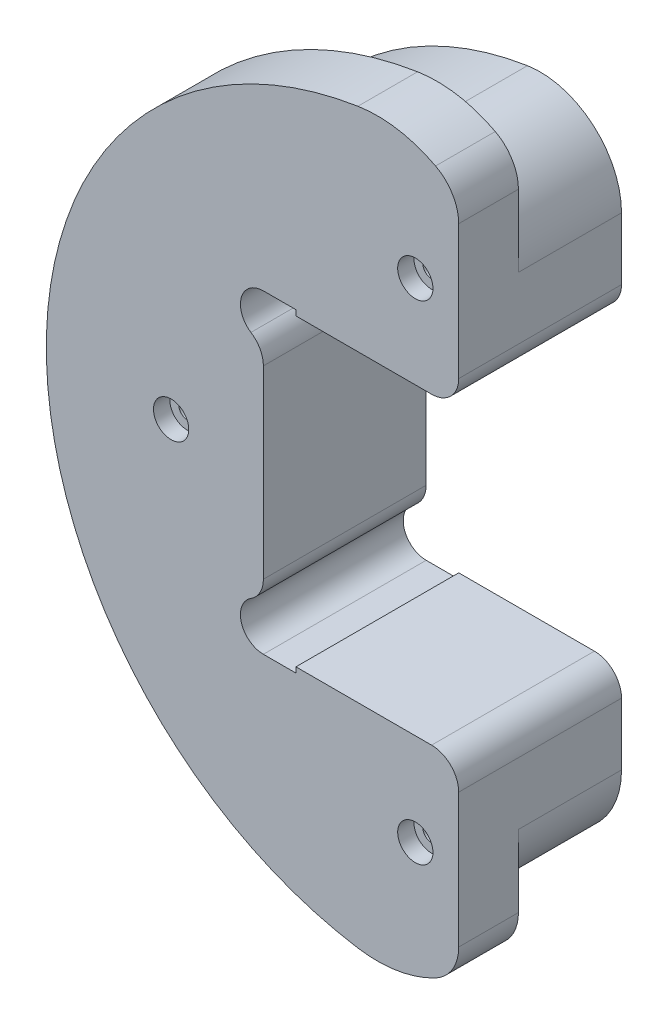
ISO-10303-21;
HEADER;
FILE_DESCRIPTION(('STEP AP214'),'2;1');
FILE_NAME('part.step','',(''),(''),'','','');
FILE_SCHEMA(('AUTOMOTIVE_DESIGN { 1 0 10303 214 1 1 1 1 }'));
ENDSEC;
DATA;
#1=APPLICATION_CONTEXT('core data for automotive mechanical design processes');
#2=APPLICATION_PROTOCOL_DEFINITION('international standard','automotive_design',2000,#1);
#3=PRODUCT_CONTEXT('',#1,'mechanical');
#4=PRODUCT('Part','Part','',(#3));
#5=PRODUCT_RELATED_PRODUCT_CATEGORY('part','',(#4));
#6=PRODUCT_DEFINITION_FORMATION('','',#4);
#7=PRODUCT_DEFINITION_CONTEXT('part definition',#1,'design');
#8=PRODUCT_DEFINITION('design','',#6,#7);
#9=PRODUCT_DEFINITION_SHAPE('','',#8);
#10=(LENGTH_UNIT() NAMED_UNIT(*) SI_UNIT(.MILLI.,.METRE.));
#11=(NAMED_UNIT(*) PLANE_ANGLE_UNIT() SI_UNIT($,.RADIAN.));
#12=(NAMED_UNIT(*) SI_UNIT($,.STERADIAN.) SOLID_ANGLE_UNIT());
#13=UNCERTAINTY_MEASURE_WITH_UNIT(LENGTH_MEASURE(1.E-05),#10,'distance_accuracy_value','');
#14=(GEOMETRIC_REPRESENTATION_CONTEXT(3) GLOBAL_UNCERTAINTY_ASSIGNED_CONTEXT((#13)) GLOBAL_UNIT_ASSIGNED_CONTEXT((#10,
#11,#12)) REPRESENTATION_CONTEXT('',''));
#15=CARTESIAN_POINT('',(0.,0.,0.));
#16=DIRECTION('',(0.,0.,1.));
#17=DIRECTION('',(1.,0.,0.));
#18=AXIS2_PLACEMENT_3D('',#15,#16,#17);
#19=CARTESIAN_POINT('',(0.,0.,30.));
#20=DIRECTION('',(0.,0.,-1.));
#21=DIRECTION('',(-1.,0.,0.));
#22=AXIS2_PLACEMENT_3D('',#19,#20,#21);
#23=CYLINDRICAL_SURFACE('',#22,60.);
#24=CARTESIAN_POINT('',(0.,0.,19.));
#25=DIRECTION('',(0.,0.,-1.));
#26=DIRECTION('',(1.,0.,0.));
#27=AXIS2_PLACEMENT_3D('',#24,#25,#26);
#28=CIRCLE('',#27,60.);
#29=CARTESIAN_POINT('',(-9.33333333333332,-59.269628722381,19.));
#30=VERTEX_POINT('',#29);
#31=CARTESIAN_POINT('',(-9.33333333333333,59.269628722381,19.));
#32=VERTEX_POINT('',#31);
#33=EDGE_CURVE('E212',#30,#32,#28,.T.);
#34=ORIENTED_EDGE('',*,*,#33,.T.);
#35=DIRECTION('',(0.,0.,-1.));
#36=VECTOR('',#35,1.);
#37=CARTESIAN_POINT('',(-9.33333333333333,59.269628722381,30.));
#38=LINE('',#37,#36);
#39=CARTESIAN_POINT('',(-9.33333333333333,59.269628722381,0.));
#40=VERTEX_POINT('',#39);
#41=EDGE_CURVE('E231',#32,#40,#38,.T.);
#42=ORIENTED_EDGE('',*,*,#41,.T.);
#43=CARTESIAN_POINT('',(0.,0.,0.));
#44=DIRECTION('',(0.,0.,1.));
#45=DIRECTION('',(1.,0.,0.));
#46=AXIS2_PLACEMENT_3D('',#43,#44,#45);
#47=CIRCLE('',#46,60.);
#48=CARTESIAN_POINT('',(-9.33333333333332,-59.269628722381,0.));
#49=VERTEX_POINT('',#48);
#50=EDGE_CURVE('E360',#40,#49,#47,.T.);
#51=ORIENTED_EDGE('',*,*,#50,.T.);
#52=DIRECTION('',(0.,0.,-1.));
#53=VECTOR('',#52,1.);
#54=CARTESIAN_POINT('',(-9.33333333333332,-59.269628722381,30.));
#55=LINE('',#54,#53);
#56=EDGE_CURVE('E233',#49,#30,#55,.F.);
#57=ORIENTED_EDGE('',*,*,#56,.T.);
#58=EDGE_LOOP('',(#34,#42,#51,#57));
#59=FACE_BOUND('',#58,.T.);
#60=ADVANCED_FACE('F40',(#59),#23,.T.);
#61=CARTESIAN_POINT('',(-6.99999999999999,-44.4522215417857,30.));
#62=DIRECTION('',(0.,0.,-1.));
#63=DIRECTION('',(-1.,0.,0.));
#64=AXIS2_PLACEMENT_3D('',#61,#62,#63);
#65=CYLINDRICAL_SURFACE('',#64,15.);
#66=DIRECTION('',(0.,0.,-1.));
#67=VECTOR('',#66,1.);
#68=CARTESIAN_POINT('',(8.00000000000001,-44.4522215417857,30.));
#69=LINE('',#68,#67);
#70=CARTESIAN_POINT('',(8.00000000000001,-44.4522215417857,19.));
#71=VERTEX_POINT('',#70);
#72=CARTESIAN_POINT('',(8.00000000000001,-44.4522215417857,0.));
#73=VERTEX_POINT('',#72);
#74=EDGE_CURVE('E203',#71,#73,#69,.T.);
#75=ORIENTED_EDGE('',*,*,#74,.F.);
#76=CARTESIAN_POINT('',(-6.99999999999999,-44.4522215417857,19.));
#77=DIRECTION('',(0.,0.,-1.));
#78=DIRECTION('',(1.,0.,0.));
#79=AXIS2_PLACEMENT_3D('',#76,#77,#78);
#80=CIRCLE('',#79,15.);
#81=EDGE_CURVE('E205',#71,#30,#80,.T.);
#82=ORIENTED_EDGE('',*,*,#81,.T.);
#83=ORIENTED_EDGE('',*,*,#56,.F.);
#84=CARTESIAN_POINT('',(-6.99999999999999,-44.4522215417857,0.));
#85=DIRECTION('',(0.,0.,1.));
#86=DIRECTION('',(1.,0.,0.));
#87=AXIS2_PLACEMENT_3D('',#84,#85,#86);
#88=CIRCLE('',#87,15.);
#89=EDGE_CURVE('E218',#73,#49,#88,.F.);
#90=ORIENTED_EDGE('',*,*,#89,.F.);
#91=EDGE_LOOP('',(#75,#82,#83,#90));
#92=FACE_BOUND('',#91,.T.);
#93=ADVANCED_FACE('F217',(#92),#65,.T.);
#94=CARTESIAN_POINT('',(-7.,44.4522215417857,30.));
#95=DIRECTION('',(0.,0.,-1.));
#96=DIRECTION('',(-1.,0.,0.));
#97=AXIS2_PLACEMENT_3D('',#94,#95,#96);
#98=CYLINDRICAL_SURFACE('',#97,15.);
#99=ORIENTED_EDGE('',*,*,#41,.F.);
#100=CARTESIAN_POINT('',(-7.,44.4522215417857,19.));
#101=DIRECTION('',(0.,0.,-1.));
#102=DIRECTION('',(1.,0.,0.));
#103=AXIS2_PLACEMENT_3D('',#100,#101,#102);
#104=CIRCLE('',#103,15.);
#105=CARTESIAN_POINT('',(8.,44.4522215417857,19.));
#106=VERTEX_POINT('',#105);
#107=EDGE_CURVE('E519',#32,#106,#104,.T.);
#108=ORIENTED_EDGE('',*,*,#107,.T.);
#109=DIRECTION('',(0.,0.,-1.));
#110=VECTOR('',#109,1.);
#111=CARTESIAN_POINT('',(8.,44.4522215417857,30.));
#112=LINE('',#111,#110);
#113=CARTESIAN_POINT('',(8.,44.4522215417857,0.));
#114=VERTEX_POINT('',#113);
#115=EDGE_CURVE('E235',#114,#106,#112,.F.);
#116=ORIENTED_EDGE('',*,*,#115,.F.);
#117=CARTESIAN_POINT('',(-7.,44.4522215417857,0.));
#118=DIRECTION('',(0.,0.,1.));
#119=DIRECTION('',(1.,0.,0.));
#120=AXIS2_PLACEMENT_3D('',#117,#118,#119);
#121=CIRCLE('',#120,15.);
#122=EDGE_CURVE('E220',#40,#114,#121,.F.);
#123=ORIENTED_EDGE('',*,*,#122,.F.);
#124=EDGE_LOOP('',(#99,#108,#116,#123));
#125=FACE_BOUND('',#124,.T.);
#126=ADVANCED_FACE('F459',(#125),#98,.T.);
#127=CARTESIAN_POINT('',(-28.,29.,30.));
#128=DIRECTION('',(-1.,0.,0.));
#129=DIRECTION('',(0.,0.,1.));
#130=AXIS2_PLACEMENT_3D('',#127,#128,#129);
#131=PLANE('',#130);
#132=DIRECTION('',(0.,1.,0.));
#133=VECTOR('',#132,1.);
#134=CARTESIAN_POINT('',(-28.,29.,30.));
#135=LINE('',#134,#133);
#136=CARTESIAN_POINT('',(-28.,-17.0225407127802,30.));
#137=VERTEX_POINT('',#136);
#138=CARTESIAN_POINT('',(-28.,17.0225407127803,30.));
#139=VERTEX_POINT('',#138);
#140=EDGE_CURVE('E371',#137,#139,#135,.T.);
#141=ORIENTED_EDGE('',*,*,#140,.F.);
#142=DIRECTION('',(0.,0.,1.));
#143=VECTOR('',#142,1.);
#144=CARTESIAN_POINT('',(-28.,-17.0225407127802,0.));
#145=LINE('',#144,#143);
#146=CARTESIAN_POINT('',(-28.,-17.0225407127802,0.));
#147=VERTEX_POINT('',#146);
#148=EDGE_CURVE('E267',#137,#147,#145,.F.);
#149=ORIENTED_EDGE('',*,*,#148,.T.);
#150=DIRECTION('',(0.,1.,0.));
#151=VECTOR('',#150,1.);
#152=CARTESIAN_POINT('',(-28.,29.,0.));
#153=LINE('',#152,#151);
#154=CARTESIAN_POINT('',(-28.,17.0225407127803,0.));
#155=VERTEX_POINT('',#154);
#156=EDGE_CURVE('E395',#147,#155,#153,.T.);
#157=ORIENTED_EDGE('',*,*,#156,.T.);
#158=DIRECTION('',(0.,0.,1.));
#159=VECTOR('',#158,1.);
#160=CARTESIAN_POINT('',(-28.,17.0225407127802,30.));
#161=LINE('',#160,#159);
#162=EDGE_CURVE('E265',#155,#139,#161,.T.);
#163=ORIENTED_EDGE('',*,*,#162,.T.);
#164=EDGE_LOOP('',(#141,#149,#157,#163));
#165=FACE_BOUND('',#164,.T.);
#166=ADVANCED_FACE('F466',(#165),#131,.F.);
#167=CARTESIAN_POINT('',(0.,0.,30.));
#168=DIRECTION('',(0.,0.,1.));
#169=DIRECTION('',(1.,0.,0.));
#170=AXIS2_PLACEMENT_3D('',#167,#168,#169);
#171=PLANE('',#170);
#172=DIRECTION('',(0.,1.,0.));
#173=VECTOR('',#172,1.);
#174=CARTESIAN_POINT('',(8.,59.464274989274,30.));
#175=LINE('',#174,#173);
#176=CARTESIAN_POINT('',(8.,33.,30.));
#177=VERTEX_POINT('',#176);
#178=CARTESIAN_POINT('',(8.,57.7187207032073,30.));
#179=VERTEX_POINT('',#178);
#180=EDGE_CURVE('E381',#177,#179,#175,.T.);
#181=ORIENTED_EDGE('',*,*,#180,.T.);
#182=CARTESIAN_POINT('',(0.,57.7187207032073,30.));
#183=DIRECTION('',(0.,0.,1.));
#184=DIRECTION('',(1.,0.,0.));
#185=AXIS2_PLACEMENT_3D('',#182,#183,#184);
#186=CIRCLE('',#185,8.);
#187=CARTESIAN_POINT('',(3.73333333333334,64.7941869226322,30.));
#188=VERTEX_POINT('',#187);
#189=EDGE_CURVE('E280',#179,#188,#186,.T.);
#190=ORIENTED_EDGE('',*,*,#189,.T.);
#191=CARTESIAN_POINT('',(-7.,44.4522215417857,30.));
#192=DIRECTION('',(0.,0.,1.));
#193=DIRECTION('',(1.,0.,0.));
#194=AXIS2_PLACEMENT_3D('',#191,#192,#193);
#195=CIRCLE('',#194,23.);
#196=CARTESIAN_POINT('',(-10.5777777777778,67.1722458853651,30.));
#197=VERTEX_POINT('',#196);
#198=EDGE_CURVE('E301',#188,#197,#195,.T.);
#199=ORIENTED_EDGE('',*,*,#198,.T.);
#200=CARTESIAN_POINT('',(0.,0.,30.));
#201=DIRECTION('',(0.,0.,1.));
#202=DIRECTION('',(1.,0.,0.));
#203=AXIS2_PLACEMENT_3D('',#200,#201,#202);
#204=CIRCLE('',#203,68.);
#205=CARTESIAN_POINT('',(-10.5777777777778,-67.1722458853651,30.));
#206=VERTEX_POINT('',#205);
#207=EDGE_CURVE('E300',#197,#206,#204,.T.);
#208=ORIENTED_EDGE('',*,*,#207,.T.);
#209=CARTESIAN_POINT('',(-6.99999999999999,-44.4522215417857,30.));
#210=DIRECTION('',(0.,0.,1.));
#211=DIRECTION('',(1.,0.,0.));
#212=AXIS2_PLACEMENT_3D('',#209,#210,#211);
#213=CIRCLE('',#212,23.);
#214=CARTESIAN_POINT('',(3.73333333333335,-64.7941869226322,30.));
#215=VERTEX_POINT('',#214);
#216=EDGE_CURVE('E292',#206,#215,#213,.T.);
#217=ORIENTED_EDGE('',*,*,#216,.T.);
#218=CARTESIAN_POINT('',(0.,-57.7187207032073,30.));
#219=DIRECTION('',(0.,0.,1.));
#220=DIRECTION('',(1.,0.,0.));
#221=AXIS2_PLACEMENT_3D('',#218,#219,#220);
#222=CIRCLE('',#221,8.);
#223=CARTESIAN_POINT('',(8.00000000000002,-57.7187207032073,30.));
#224=VERTEX_POINT('',#223);
#225=EDGE_CURVE('E278',#215,#224,#222,.T.);
#226=ORIENTED_EDGE('',*,*,#225,.T.);
#227=DIRECTION('',(0.,1.,0.));
#228=VECTOR('',#227,1.);
#229=CARTESIAN_POINT('',(8.00000000000001,-28.,30.));
#230=LINE('',#229,#228);
#231=CARTESIAN_POINT('',(8.00000000000001,-33.,30.));
#232=VERTEX_POINT('',#231);
#233=EDGE_CURVE('E361',#224,#232,#230,.T.);
#234=ORIENTED_EDGE('',*,*,#233,.T.);
#235=CARTESIAN_POINT('',(3.00000000000001,-33.,30.));
#236=DIRECTION('',(0.,0.,1.));
#237=DIRECTION('',(1.,0.,0.));
#238=AXIS2_PLACEMENT_3D('',#235,#236,#237);
#239=CIRCLE('',#238,5.);
#240=CARTESIAN_POINT('',(3.00000000000001,-28.,30.));
#241=VERTEX_POINT('',#240);
#242=EDGE_CURVE('E255',#232,#241,#239,.T.);
#243=ORIENTED_EDGE('',*,*,#242,.T.);
#244=DIRECTION('',(-1.,0.,0.));
#245=VECTOR('',#244,1.);
#246=CARTESIAN_POINT('',(-22.,-28.,30.));
#247=LINE('',#246,#245);
#248=CARTESIAN_POINT('',(-22.,-28.,30.));
#249=VERTEX_POINT('',#248);
#250=EDGE_CURVE('E363',#241,#249,#247,.T.);
#251=ORIENTED_EDGE('',*,*,#250,.T.);
#252=DIRECTION('',(0.,-1.,0.));
#253=VECTOR('',#252,1.);
#254=CARTESIAN_POINT('',(-22.,-29.,30.));
#255=LINE('',#254,#253);
#256=CARTESIAN_POINT('',(-22.,-29.,30.));
#257=VERTEX_POINT('',#256);
#258=EDGE_CURVE('E366',#249,#257,#255,.T.);
#259=ORIENTED_EDGE('',*,*,#258,.T.);
#260=DIRECTION('',(-1.,0.,0.));
#261=VECTOR('',#260,1.);
#262=CARTESIAN_POINT('',(-28.,-29.,30.));
#263=LINE('',#262,#261);
#264=CARTESIAN_POINT('',(-28.,-29.,30.));
#265=VERTEX_POINT('',#264);
#266=EDGE_CURVE('E368',#257,#265,#263,.T.);
#267=ORIENTED_EDGE('',*,*,#266,.T.);
#268=CARTESIAN_POINT('',(-28.,-24.775,30.));
#269=DIRECTION('',(0.,0.,1.));
#270=DIRECTION('',(-1.,0.,0.));
#271=AXIS2_PLACEMENT_3D('',#268,#269,#270);
#272=CIRCLE('',#271,4.225);
#273=CARTESIAN_POINT('',(-30.289972899729,-21.2244156652029,30.));
#274=VERTEX_POINT('',#273);
#275=EDGE_CURVE('E315',#274,#265,#272,.T.);
#276=ORIENTED_EDGE('',*,*,#275,.F.);
#277=CARTESIAN_POINT('',(-33.,-17.0225407127802,30.));
#278=DIRECTION('',(0.,0.,1.));
#279=DIRECTION('',(1.,0.,0.));
#280=AXIS2_PLACEMENT_3D('',#277,#278,#279);
#281=CIRCLE('',#280,5.);
#282=EDGE_CURVE('E253',#274,#137,#281,.T.);
#283=ORIENTED_EDGE('',*,*,#282,.T.);
#284=ORIENTED_EDGE('',*,*,#140,.T.);
#285=CARTESIAN_POINT('',(-33.,17.0225407127802,30.));
#286=DIRECTION('',(0.,0.,1.));
#287=DIRECTION('',(1.,0.,0.));
#288=AXIS2_PLACEMENT_3D('',#285,#286,#287);
#289=CIRCLE('',#288,5.);
#290=CARTESIAN_POINT('',(-30.289972899729,21.2244156652029,30.));
#291=VERTEX_POINT('',#290);
#292=EDGE_CURVE('E251',#139,#291,#289,.T.);
#293=ORIENTED_EDGE('',*,*,#292,.T.);
#294=CARTESIAN_POINT('',(-28.,24.775,30.));
#295=DIRECTION('',(0.,0.,1.));
#296=DIRECTION('',(1.,0.,0.));
#297=AXIS2_PLACEMENT_3D('',#294,#295,#296);
#298=CIRCLE('',#297,4.225);
#299=CARTESIAN_POINT('',(-28.,29.,30.));
#300=VERTEX_POINT('',#299);
#301=EDGE_CURVE('E319',#300,#291,#298,.T.);
#302=ORIENTED_EDGE('',*,*,#301,.F.);
#303=DIRECTION('',(1.,0.,0.));
#304=VECTOR('',#303,1.);
#305=CARTESIAN_POINT('',(-22.,29.,30.));
#306=LINE('',#305,#304);
#307=CARTESIAN_POINT('',(-22.,29.,30.));
#308=VERTEX_POINT('',#307);
#309=EDGE_CURVE('E374',#300,#308,#306,.T.);
#310=ORIENTED_EDGE('',*,*,#309,.T.);
#311=DIRECTION('',(0.,-1.,0.));
#312=VECTOR('',#311,1.);
#313=CARTESIAN_POINT('',(-22.,28.,30.));
#314=LINE('',#313,#312);
#315=CARTESIAN_POINT('',(-22.,28.,30.));
#316=VERTEX_POINT('',#315);
#317=EDGE_CURVE('E376',#308,#316,#314,.T.);
#318=ORIENTED_EDGE('',*,*,#317,.T.);
#319=DIRECTION('',(1.,0.,0.));
#320=VECTOR('',#319,1.);
#321=CARTESIAN_POINT('',(8.,28.,30.));
#322=LINE('',#321,#320);
#323=CARTESIAN_POINT('',(3.,28.,30.));
#324=VERTEX_POINT('',#323);
#325=EDGE_CURVE('E378',#316,#324,#322,.T.);
#326=ORIENTED_EDGE('',*,*,#325,.T.);
#327=CARTESIAN_POINT('',(3.,33.,30.));
#328=DIRECTION('',(0.,0.,1.));
#329=DIRECTION('',(1.,0.,0.));
#330=AXIS2_PLACEMENT_3D('',#327,#328,#329);
#331=CIRCLE('',#330,5.);
#332=EDGE_CURVE('E257',#324,#177,#331,.T.);
#333=ORIENTED_EDGE('',*,*,#332,.T.);
#334=EDGE_LOOP('',(#181,#190,#199,#208,#217,#226,#234,#243,#251,#259,#267,#276,#283,#284,#293,
#302,#310,#318,#326,#333));
#335=FACE_BOUND('',#334,.T.);
#336=CARTESIAN_POINT('',(0.,45.,30.));
#337=DIRECTION('',(0.,0.,1.));
#338=DIRECTION('',(1.,0.,0.));
#339=AXIS2_PLACEMENT_3D('',#336,#337,#338);
#340=CIRCLE('',#339,3.25);
#341=CARTESIAN_POINT('',(3.25,45.,30.));
#342=VERTEX_POINT('',#341);
#343=EDGE_CURVE('E322',#342,#342,#340,.T.);
#344=ORIENTED_EDGE('',*,*,#343,.F.);
#345=EDGE_LOOP('',(#344));
#346=FACE_BOUND('',#345,.T.);
#347=CARTESIAN_POINT('',(-45.,0.,30.));
#348=DIRECTION('',(0.,0.,1.));
#349=DIRECTION('',(1.,0.,0.));
#350=AXIS2_PLACEMENT_3D('',#347,#348,#349);
#351=CIRCLE('',#350,3.25);
#352=CARTESIAN_POINT('',(-41.75,0.,30.));
#353=VERTEX_POINT('',#352);
#354=EDGE_CURVE('E336',#353,#353,#351,.T.);
#355=ORIENTED_EDGE('',*,*,#354,.F.);
#356=EDGE_LOOP('',(#355));
#357=FACE_BOUND('',#356,.T.);
#358=CARTESIAN_POINT('',(0.,-45.,30.));
#359=DIRECTION('',(0.,0.,1.));
#360=DIRECTION('',(1.,0.,0.));
#361=AXIS2_PLACEMENT_3D('',#358,#359,#360);
#362=CIRCLE('',#361,3.25);
#363=CARTESIAN_POINT('',(3.25,-45.,30.));
#364=VERTEX_POINT('',#363);
#365=EDGE_CURVE('E348',#364,#364,#362,.T.);
#366=ORIENTED_EDGE('',*,*,#365,.F.);
#367=EDGE_LOOP('',(#366));
#368=FACE_BOUND('',#367,.T.);
#369=ADVANCED_FACE('F297',(#335,#346,#357,#368),#171,.T.);
#370=CARTESIAN_POINT('',(0.,0.,0.));
#371=DIRECTION('',(0.,0.,1.));
#372=DIRECTION('',(1.,0.,0.));
#373=AXIS2_PLACEMENT_3D('',#370,#371,#372);
#374=PLANE('',#373);
#375=CARTESIAN_POINT('',(0.,45.,0.));
#376=DIRECTION('',(0.,0.,1.));
#377=DIRECTION('',(1.,0.,0.));
#378=AXIS2_PLACEMENT_3D('',#375,#376,#377);
#379=CIRCLE('',#378,1.59999999999999);
#380=CARTESIAN_POINT('',(1.59999999999999,45.,0.));
#381=VERTEX_POINT('',#380);
#382=EDGE_CURVE('E333',#381,#381,#379,.T.);
#383=ORIENTED_EDGE('',*,*,#382,.T.);
#384=EDGE_LOOP('',(#383));
#385=FACE_BOUND('',#384,.T.);
#386=CARTESIAN_POINT('',(-45.,0.,0.));
#387=DIRECTION('',(0.,0.,1.));
#388=DIRECTION('',(1.,0.,0.));
#389=AXIS2_PLACEMENT_3D('',#386,#387,#388);
#390=CIRCLE('',#389,1.59999999999999);
#391=CARTESIAN_POINT('',(-43.4,0.,0.));
#392=VERTEX_POINT('',#391);
#393=EDGE_CURVE('E345',#392,#392,#390,.T.);
#394=ORIENTED_EDGE('',*,*,#393,.T.);
#395=EDGE_LOOP('',(#394));
#396=FACE_BOUND('',#395,.T.);
#397=CARTESIAN_POINT('',(0.,-45.,0.));
#398=DIRECTION('',(0.,0.,1.));
#399=DIRECTION('',(1.,0.,0.));
#400=AXIS2_PLACEMENT_3D('',#397,#398,#399);
#401=CIRCLE('',#400,1.59999999999999);
#402=CARTESIAN_POINT('',(1.6,-45.,0.));
#403=VERTEX_POINT('',#402);
#404=EDGE_CURVE('E357',#403,#403,#401,.T.);
#405=ORIENTED_EDGE('',*,*,#404,.T.);
#406=EDGE_LOOP('',(#405));
#407=FACE_BOUND('',#406,.T.);
#408=DIRECTION('',(0.,1.,0.));
#409=VECTOR('',#408,1.);
#410=CARTESIAN_POINT('',(8.,59.464274989274,0.));
#411=LINE('',#410,#409);
#412=CARTESIAN_POINT('',(8.,33.,0.));
#413=VERTEX_POINT('',#412);
#414=EDGE_CURVE('E364',#413,#114,#411,.T.);
#415=ORIENTED_EDGE('',*,*,#414,.F.);
#416=CARTESIAN_POINT('',(3.,33.,0.));
#417=DIRECTION('',(0.,0.,1.));
#418=DIRECTION('',(1.,0.,0.));
#419=AXIS2_PLACEMENT_3D('',#416,#417,#418);
#420=CIRCLE('',#419,5.);
#421=CARTESIAN_POINT('',(3.,28.,0.));
#422=VERTEX_POINT('',#421);
#423=EDGE_CURVE('E247',#413,#422,#420,.F.);
#424=ORIENTED_EDGE('',*,*,#423,.T.);
#425=DIRECTION('',(1.,0.,0.));
#426=VECTOR('',#425,1.);
#427=CARTESIAN_POINT('',(8.,28.,0.));
#428=LINE('',#427,#426);
#429=CARTESIAN_POINT('',(-22.,28.,0.));
#430=VERTEX_POINT('',#429);
#431=EDGE_CURVE('E402',#430,#422,#428,.T.);
#432=ORIENTED_EDGE('',*,*,#431,.F.);
#433=DIRECTION('',(0.,-1.,0.));
#434=VECTOR('',#433,1.);
#435=CARTESIAN_POINT('',(-22.,28.,0.));
#436=LINE('',#435,#434);
#437=CARTESIAN_POINT('',(-22.,29.,0.));
#438=VERTEX_POINT('',#437);
#439=EDGE_CURVE('E400',#438,#430,#436,.T.);
#440=ORIENTED_EDGE('',*,*,#439,.F.);
#441=DIRECTION('',(1.,0.,0.));
#442=VECTOR('',#441,1.);
#443=CARTESIAN_POINT('',(-22.,29.,0.));
#444=LINE('',#443,#442);
#445=CARTESIAN_POINT('',(-28.,29.,0.));
#446=VERTEX_POINT('',#445);
#447=EDGE_CURVE('E398',#446,#438,#444,.T.);
#448=ORIENTED_EDGE('',*,*,#447,.F.);
#449=CARTESIAN_POINT('',(-28.,24.775,0.));
#450=DIRECTION('',(0.,0.,1.));
#451=DIRECTION('',(1.,0.,0.));
#452=AXIS2_PLACEMENT_3D('',#449,#450,#451);
#453=CIRCLE('',#452,4.225);
#454=CARTESIAN_POINT('',(-30.289972899729,21.2244156652029,0.));
#455=VERTEX_POINT('',#454);
#456=EDGE_CURVE('E317',#446,#455,#453,.T.);
#457=ORIENTED_EDGE('',*,*,#456,.T.);
#458=CARTESIAN_POINT('',(-33.,17.0225407127802,0.));
#459=DIRECTION('',(0.,0.,1.));
#460=DIRECTION('',(1.,0.,0.));
#461=AXIS2_PLACEMENT_3D('',#458,#459,#460);
#462=CIRCLE('',#461,5.);
#463=EDGE_CURVE('E241',#455,#155,#462,.F.);
#464=ORIENTED_EDGE('',*,*,#463,.T.);
#465=ORIENTED_EDGE('',*,*,#156,.F.);
#466=CARTESIAN_POINT('',(-33.,-17.0225407127802,0.));
#467=DIRECTION('',(0.,0.,1.));
#468=DIRECTION('',(1.,0.,0.));
#469=AXIS2_PLACEMENT_3D('',#466,#467,#468);
#470=CIRCLE('',#469,5.);
#471=CARTESIAN_POINT('',(-30.289972899729,-21.2244156652029,0.));
#472=VERTEX_POINT('',#471);
#473=EDGE_CURVE('E243',#147,#472,#470,.F.);
#474=ORIENTED_EDGE('',*,*,#473,.T.);
#475=CARTESIAN_POINT('',(-28.,-24.775,0.));
#476=DIRECTION('',(0.,0.,1.));
#477=DIRECTION('',(-1.,0.,0.));
#478=AXIS2_PLACEMENT_3D('',#475,#476,#477);
#479=CIRCLE('',#478,4.225);
#480=CARTESIAN_POINT('',(-28.,-29.,0.));
#481=VERTEX_POINT('',#480);
#482=EDGE_CURVE('E311',#472,#481,#479,.T.);
#483=ORIENTED_EDGE('',*,*,#482,.T.);
#484=DIRECTION('',(-1.,0.,0.));
#485=VECTOR('',#484,1.);
#486=CARTESIAN_POINT('',(-28.,-29.,0.));
#487=LINE('',#486,#485);
#488=CARTESIAN_POINT('',(-22.,-29.,0.));
#489=VERTEX_POINT('',#488);
#490=EDGE_CURVE('E392',#489,#481,#487,.T.);
#491=ORIENTED_EDGE('',*,*,#490,.F.);
#492=DIRECTION('',(0.,-1.,0.));
#493=VECTOR('',#492,1.);
#494=CARTESIAN_POINT('',(-22.,-29.,0.));
#495=LINE('',#494,#493);
#496=CARTESIAN_POINT('',(-22.,-28.,0.));
#497=VERTEX_POINT('',#496);
#498=EDGE_CURVE('E390',#497,#489,#495,.T.);
#499=ORIENTED_EDGE('',*,*,#498,.F.);
#500=DIRECTION('',(-1.,0.,0.));
#501=VECTOR('',#500,1.);
#502=CARTESIAN_POINT('',(-22.,-28.,0.));
#503=LINE('',#502,#501);
#504=CARTESIAN_POINT('',(3.00000000000001,-28.,0.));
#505=VERTEX_POINT('',#504);
#506=EDGE_CURVE('E388',#505,#497,#503,.T.);
#507=ORIENTED_EDGE('',*,*,#506,.F.);
#508=CARTESIAN_POINT('',(3.00000000000001,-33.,0.));
#509=DIRECTION('',(0.,0.,1.));
#510=DIRECTION('',(1.,0.,0.));
#511=AXIS2_PLACEMENT_3D('',#508,#509,#510);
#512=CIRCLE('',#511,5.);
#513=CARTESIAN_POINT('',(8.00000000000001,-33.,0.));
#514=VERTEX_POINT('',#513);
#515=EDGE_CURVE('E245',#505,#514,#512,.F.);
#516=ORIENTED_EDGE('',*,*,#515,.T.);
#517=DIRECTION('',(0.,1.,0.));
#518=VECTOR('',#517,1.);
#519=CARTESIAN_POINT('',(8.00000000000001,-28.,0.));
#520=LINE('',#519,#518);
#521=EDGE_CURVE('E386',#73,#514,#520,.T.);
#522=ORIENTED_EDGE('',*,*,#521,.F.);
#523=ORIENTED_EDGE('',*,*,#89,.T.);
#524=ORIENTED_EDGE('',*,*,#50,.F.);
#525=ORIENTED_EDGE('',*,*,#122,.T.);
#526=EDGE_LOOP('',(#415,#424,#432,#440,#448,#457,#464,#465,#474,#483,#491,#499,#507,#516,#522,
#523,#524,#525));
#527=FACE_BOUND('',#526,.T.);
#528=ADVANCED_FACE('F428',(#385,#396,#407,#527),#374,.F.);
#529=CARTESIAN_POINT('',(8.00000000000001,-28.,30.));
#530=DIRECTION('',(-1.,0.,0.));
#531=DIRECTION('',(0.,-1.,0.));
#532=AXIS2_PLACEMENT_3D('',#529,#530,#531);
#533=PLANE('',#532);
#534=ORIENTED_EDGE('',*,*,#233,.F.);
#535=DIRECTION('',(0.,0.,-1.));
#536=VECTOR('',#535,1.);
#537=CARTESIAN_POINT('',(8.00000000000002,-57.7187207032073,19.));
#538=LINE('',#537,#536);
#539=CARTESIAN_POINT('',(8.00000000000001,-57.7187207032073,19.));
#540=VERTEX_POINT('',#539);
#541=EDGE_CURVE('E11',#224,#540,#538,.T.);
#542=ORIENTED_EDGE('',*,*,#541,.T.);
#543=DIRECTION('',(0.,1.,0.));
#544=VECTOR('',#543,1.);
#545=CARTESIAN_POINT('',(8.00000000000001,-44.4522215417857,19.));
#546=LINE('',#545,#544);
#547=EDGE_CURVE('E198',#540,#71,#546,.T.);
#548=ORIENTED_EDGE('',*,*,#547,.T.);
#549=ORIENTED_EDGE('',*,*,#74,.T.);
#550=ORIENTED_EDGE('',*,*,#521,.T.);
#551=DIRECTION('',(0.,0.,-1.));
#552=VECTOR('',#551,1.);
#553=CARTESIAN_POINT('',(8.00000000000001,-33.,30.));
#554=LINE('',#553,#552);
#555=EDGE_CURVE('E262',#514,#232,#554,.F.);
#556=ORIENTED_EDGE('',*,*,#555,.T.);
#557=EDGE_LOOP('',(#534,#542,#548,#549,#550,#556));
#558=FACE_BOUND('',#557,.T.);
#559=ADVANCED_FACE('F200',(#558),#533,.F.);
#560=CARTESIAN_POINT('',(-22.,-28.,30.));
#561=DIRECTION('',(0.,-1.,0.));
#562=DIRECTION('',(0.,0.,-1.));
#563=AXIS2_PLACEMENT_3D('',#560,#561,#562);
#564=PLANE('',#563);
#565=ORIENTED_EDGE('',*,*,#250,.F.);
#566=DIRECTION('',(0.,0.,-1.));
#567=VECTOR('',#566,1.);
#568=CARTESIAN_POINT('',(3.00000000000001,-28.,30.));
#569=LINE('',#568,#567);
#570=EDGE_CURVE('E259',#241,#505,#569,.T.);
#571=ORIENTED_EDGE('',*,*,#570,.T.);
#572=ORIENTED_EDGE('',*,*,#506,.T.);
#573=DIRECTION('',(0.,0.,-1.));
#574=VECTOR('',#573,1.);
#575=CARTESIAN_POINT('',(-22.,-28.,30.));
#576=LINE('',#575,#574);
#577=EDGE_CURVE('E221',#249,#497,#576,.T.);
#578=ORIENTED_EDGE('',*,*,#577,.F.);
#579=EDGE_LOOP('',(#565,#571,#572,#578));
#580=FACE_BOUND('',#579,.T.);
#581=ADVANCED_FACE('F441',(#580),#564,.F.);
#582=CARTESIAN_POINT('',(-22.,-29.,30.));
#583=DIRECTION('',(1.,0.,0.));
#584=DIRECTION('',(0.,1.,0.));
#585=AXIS2_PLACEMENT_3D('',#582,#583,#584);
#586=PLANE('',#585);
#587=ORIENTED_EDGE('',*,*,#498,.T.);
#588=DIRECTION('',(0.,0.,-1.));
#589=VECTOR('',#588,1.);
#590=CARTESIAN_POINT('',(-22.,-29.,30.));
#591=LINE('',#590,#589);
#592=EDGE_CURVE('E226',#257,#489,#591,.T.);
#593=ORIENTED_EDGE('',*,*,#592,.F.);
#594=ORIENTED_EDGE('',*,*,#258,.F.);
#595=ORIENTED_EDGE('',*,*,#577,.T.);
#596=EDGE_LOOP('',(#587,#593,#594,#595));
#597=FACE_BOUND('',#596,.T.);
#598=ADVANCED_FACE('F439',(#597),#586,.F.);
#599=CARTESIAN_POINT('',(-28.,-29.,30.));
#600=DIRECTION('',(0.,-1.,0.));
#601=DIRECTION('',(0.,0.,-1.));
#602=AXIS2_PLACEMENT_3D('',#599,#600,#601);
#603=PLANE('',#602);
#604=ORIENTED_EDGE('',*,*,#490,.T.);
#605=DIRECTION('',(0.,0.,-1.));
#606=VECTOR('',#605,1.);
#607=CARTESIAN_POINT('',(-28.,-29.,30.));
#608=LINE('',#607,#606);
#609=EDGE_CURVE('E414',#265,#481,#608,.T.);
#610=ORIENTED_EDGE('',*,*,#609,.F.);
#611=ORIENTED_EDGE('',*,*,#266,.F.);
#612=ORIENTED_EDGE('',*,*,#592,.T.);
#613=EDGE_LOOP('',(#604,#610,#611,#612));
#614=FACE_BOUND('',#613,.T.);
#615=ADVANCED_FACE('F421',(#614),#603,.F.);
#616=CARTESIAN_POINT('',(-22.,29.,30.));
#617=DIRECTION('',(0.,1.,0.));
#618=DIRECTION('',(0.,0.,1.));
#619=AXIS2_PLACEMENT_3D('',#616,#617,#618);
#620=PLANE('',#619);
#621=ORIENTED_EDGE('',*,*,#447,.T.);
#622=DIRECTION('',(0.,0.,-1.));
#623=VECTOR('',#622,1.);
#624=CARTESIAN_POINT('',(-22.,29.,30.));
#625=LINE('',#624,#623);
#626=EDGE_CURVE('E408',#308,#438,#625,.T.);
#627=ORIENTED_EDGE('',*,*,#626,.F.);
#628=ORIENTED_EDGE('',*,*,#309,.F.);
#629=DIRECTION('',(0.,0.,-1.));
#630=VECTOR('',#629,1.);
#631=CARTESIAN_POINT('',(-28.,29.,30.));
#632=LINE('',#631,#630);
#633=EDGE_CURVE('E411',#300,#446,#632,.T.);
#634=ORIENTED_EDGE('',*,*,#633,.T.);
#635=EDGE_LOOP('',(#621,#627,#628,#634));
#636=FACE_BOUND('',#635,.T.);
#637=ADVANCED_FACE('F496',(#636),#620,.F.);
#638=CARTESIAN_POINT('',(-22.,28.,30.));
#639=DIRECTION('',(1.,0.,0.));
#640=DIRECTION('',(0.,1.,0.));
#641=AXIS2_PLACEMENT_3D('',#638,#639,#640);
#642=PLANE('',#641);
#643=ORIENTED_EDGE('',*,*,#439,.T.);
#644=DIRECTION('',(0.,0.,-1.));
#645=VECTOR('',#644,1.);
#646=CARTESIAN_POINT('',(-22.,28.,30.));
#647=LINE('',#646,#645);
#648=EDGE_CURVE('E383',#316,#430,#647,.T.);
#649=ORIENTED_EDGE('',*,*,#648,.F.);
#650=ORIENTED_EDGE('',*,*,#317,.F.);
#651=ORIENTED_EDGE('',*,*,#626,.T.);
#652=EDGE_LOOP('',(#643,#649,#650,#651));
#653=FACE_BOUND('',#652,.T.);
#654=ADVANCED_FACE('F502',(#653),#642,.F.);
#655=CARTESIAN_POINT('',(8.,28.,30.));
#656=DIRECTION('',(0.,1.,0.));
#657=DIRECTION('',(0.,0.,1.));
#658=AXIS2_PLACEMENT_3D('',#655,#656,#657);
#659=PLANE('',#658);
#660=ORIENTED_EDGE('',*,*,#431,.T.);
#661=DIRECTION('',(0.,0.,-1.));
#662=VECTOR('',#661,1.);
#663=CARTESIAN_POINT('',(3.,28.,30.));
#664=LINE('',#663,#662);
#665=EDGE_CURVE('E249',#422,#324,#664,.F.);
#666=ORIENTED_EDGE('',*,*,#665,.T.);
#667=ORIENTED_EDGE('',*,*,#325,.F.);
#668=ORIENTED_EDGE('',*,*,#648,.T.);
#669=EDGE_LOOP('',(#660,#666,#667,#668));
#670=FACE_BOUND('',#669,.T.);
#671=ADVANCED_FACE('F506',(#670),#659,.F.);
#672=CARTESIAN_POINT('',(8.,59.464274989274,30.));
#673=DIRECTION('',(-1.,0.,0.));
#674=DIRECTION('',(0.,-1.,0.));
#675=AXIS2_PLACEMENT_3D('',#672,#673,#674);
#676=PLANE('',#675);
#677=DIRECTION('',(0.,1.,0.));
#678=VECTOR('',#677,1.);
#679=CARTESIAN_POINT('',(8.,44.4522215417857,19.));
#680=LINE('',#679,#678);
#681=CARTESIAN_POINT('',(8.,57.7187207032073,19.));
#682=VERTEX_POINT('',#681);
#683=EDGE_CURVE('E520',#106,#682,#680,.T.);
#684=ORIENTED_EDGE('',*,*,#683,.T.);
#685=DIRECTION('',(0.,0.,-1.));
#686=VECTOR('',#685,1.);
#687=CARTESIAN_POINT('',(8.,57.7187207032073,30.));
#688=LINE('',#687,#686);
#689=EDGE_CURVE('E275',#682,#179,#688,.F.);
#690=ORIENTED_EDGE('',*,*,#689,.T.);
#691=ORIENTED_EDGE('',*,*,#180,.F.);
#692=DIRECTION('',(0.,0.,-1.));
#693=VECTOR('',#692,1.);
#694=CARTESIAN_POINT('',(8.,33.,30.));
#695=LINE('',#694,#693);
#696=EDGE_CURVE('E238',#177,#413,#695,.T.);
#697=ORIENTED_EDGE('',*,*,#696,.T.);
#698=ORIENTED_EDGE('',*,*,#414,.T.);
#699=ORIENTED_EDGE('',*,*,#115,.T.);
#700=EDGE_LOOP('',(#684,#690,#691,#697,#698,#699));
#701=FACE_BOUND('',#700,.T.);
#702=ADVANCED_FACE('F513',(#701),#676,.F.);
#703=CARTESIAN_POINT('',(0.,-45.,30.));
#704=DIRECTION('',(0.,0.,1.));
#705=DIRECTION('',(1.,0.,0.));
#706=AXIS2_PLACEMENT_3D('',#703,#704,#705);
#707=CYLINDRICAL_SURFACE('',#706,1.59999999999999);
#708=ORIENTED_EDGE('',*,*,#404,.F.);
#709=EDGE_LOOP('',(#708));
#710=FACE_BOUND('',#709,.T.);
#711=CARTESIAN_POINT('',(0.,-45.,27.));
#712=DIRECTION('',(0.,0.,1.));
#713=DIRECTION('',(1.,0.,0.));
#714=AXIS2_PLACEMENT_3D('',#711,#712,#713);
#715=CIRCLE('',#714,1.6);
#716=CARTESIAN_POINT('',(1.6,-45.,27.));
#717=VERTEX_POINT('',#716);
#718=EDGE_CURVE('E354',#717,#717,#715,.T.);
#719=ORIENTED_EDGE('',*,*,#718,.T.);
#720=EDGE_LOOP('',(#719));
#721=FACE_BOUND('',#720,.T.);
#722=ADVANCED_FACE('F579',(#710,#721),#707,.F.);
#723=CARTESIAN_POINT('',(1.6,-45.,27.));
#724=DIRECTION('',(0.,0.,-1.));
#725=DIRECTION('',(-1.,0.,0.));
#726=AXIS2_PLACEMENT_3D('',#723,#724,#725);
#727=PLANE('',#726);
#728=ORIENTED_EDGE('',*,*,#718,.F.);
#729=EDGE_LOOP('',(#728));
#730=FACE_BOUND('',#729,.T.);
#731=CARTESIAN_POINT('',(0.,-45.,27.));
#732=DIRECTION('',(0.,0.,1.));
#733=DIRECTION('',(1.,0.,0.));
#734=AXIS2_PLACEMENT_3D('',#731,#732,#733);
#735=CIRCLE('',#734,3.25);
#736=CARTESIAN_POINT('',(3.25,-45.,27.));
#737=VERTEX_POINT('',#736);
#738=EDGE_CURVE('E351',#737,#737,#735,.T.);
#739=ORIENTED_EDGE('',*,*,#738,.T.);
#740=EDGE_LOOP('',(#739));
#741=FACE_BOUND('',#740,.T.);
#742=ADVANCED_FACE('F575',(#730,#741),#727,.F.);
#743=CARTESIAN_POINT('',(0.,-45.,30.));
#744=DIRECTION('',(0.,0.,1.));
#745=DIRECTION('',(1.,0.,0.));
#746=AXIS2_PLACEMENT_3D('',#743,#744,#745);
#747=CYLINDRICAL_SURFACE('',#746,3.25);
#748=ORIENTED_EDGE('',*,*,#738,.F.);
#749=EDGE_LOOP('',(#748));
#750=FACE_BOUND('',#749,.T.);
#751=ORIENTED_EDGE('',*,*,#365,.T.);
#752=EDGE_LOOP('',(#751));
#753=FACE_BOUND('',#752,.T.);
#754=ADVANCED_FACE('F571',(#750,#753),#747,.F.);
#755=CARTESIAN_POINT('',(-45.,0.,30.));
#756=DIRECTION('',(0.,0.,1.));
#757=DIRECTION('',(1.,0.,0.));
#758=AXIS2_PLACEMENT_3D('',#755,#756,#757);
#759=CYLINDRICAL_SURFACE('',#758,1.59999999999999);
#760=ORIENTED_EDGE('',*,*,#393,.F.);
#761=EDGE_LOOP('',(#760));
#762=FACE_BOUND('',#761,.T.);
#763=CARTESIAN_POINT('',(-45.,0.,27.));
#764=DIRECTION('',(0.,0.,1.));
#765=DIRECTION('',(1.,0.,0.));
#766=AXIS2_PLACEMENT_3D('',#763,#764,#765);
#767=CIRCLE('',#766,1.6);
#768=CARTESIAN_POINT('',(-43.4,0.,27.));
#769=VERTEX_POINT('',#768);
#770=EDGE_CURVE('E342',#769,#769,#767,.T.);
#771=ORIENTED_EDGE('',*,*,#770,.T.);
#772=EDGE_LOOP('',(#771));
#773=FACE_BOUND('',#772,.T.);
#774=ADVANCED_FACE('F567',(#762,#773),#759,.F.);
#775=CARTESIAN_POINT('',(-43.4,0.,27.));
#776=DIRECTION('',(0.,0.,-1.));
#777=DIRECTION('',(-1.,0.,0.));
#778=AXIS2_PLACEMENT_3D('',#775,#776,#777);
#779=PLANE('',#778);
#780=ORIENTED_EDGE('',*,*,#770,.F.);
#781=EDGE_LOOP('',(#780));
#782=FACE_BOUND('',#781,.T.);
#783=CARTESIAN_POINT('',(-45.,0.,27.));
#784=DIRECTION('',(0.,0.,1.));
#785=DIRECTION('',(1.,0.,0.));
#786=AXIS2_PLACEMENT_3D('',#783,#784,#785);
#787=CIRCLE('',#786,3.25);
#788=CARTESIAN_POINT('',(-41.75,0.,27.));
#789=VERTEX_POINT('',#788);
#790=EDGE_CURVE('E339',#789,#789,#787,.T.);
#791=ORIENTED_EDGE('',*,*,#790,.T.);
#792=EDGE_LOOP('',(#791));
#793=FACE_BOUND('',#792,.T.);
#794=ADVANCED_FACE('F563',(#782,#793),#779,.F.);
#795=CARTESIAN_POINT('',(-45.,0.,30.));
#796=DIRECTION('',(0.,0.,1.));
#797=DIRECTION('',(1.,0.,0.));
#798=AXIS2_PLACEMENT_3D('',#795,#796,#797);
#799=CYLINDRICAL_SURFACE('',#798,3.25);
#800=ORIENTED_EDGE('',*,*,#790,.F.);
#801=EDGE_LOOP('',(#800));
#802=FACE_BOUND('',#801,.T.);
#803=ORIENTED_EDGE('',*,*,#354,.T.);
#804=EDGE_LOOP('',(#803));
#805=FACE_BOUND('',#804,.T.);
#806=ADVANCED_FACE('F559',(#802,#805),#799,.F.);
#807=CARTESIAN_POINT('',(0.,45.,30.));
#808=DIRECTION('',(0.,0.,1.));
#809=DIRECTION('',(1.,0.,0.));
#810=AXIS2_PLACEMENT_3D('',#807,#808,#809);
#811=CYLINDRICAL_SURFACE('',#810,1.59999999999999);
#812=ORIENTED_EDGE('',*,*,#382,.F.);
#813=EDGE_LOOP('',(#812));
#814=FACE_BOUND('',#813,.T.);
#815=CARTESIAN_POINT('',(0.,45.,27.));
#816=DIRECTION('',(0.,0.,1.));
#817=DIRECTION('',(1.,0.,0.));
#818=AXIS2_PLACEMENT_3D('',#815,#816,#817);
#819=CIRCLE('',#818,1.6);
#820=CARTESIAN_POINT('',(1.6,45.,27.));
#821=VERTEX_POINT('',#820);
#822=EDGE_CURVE('E330',#821,#821,#819,.T.);
#823=ORIENTED_EDGE('',*,*,#822,.T.);
#824=EDGE_LOOP('',(#823));
#825=FACE_BOUND('',#824,.T.);
#826=ADVANCED_FACE('F555',(#814,#825),#811,.F.);
#827=CARTESIAN_POINT('',(1.6,45.,27.));
#828=DIRECTION('',(0.,0.,-1.));
#829=DIRECTION('',(-1.,0.,0.));
#830=AXIS2_PLACEMENT_3D('',#827,#828,#829);
#831=PLANE('',#830);
#832=ORIENTED_EDGE('',*,*,#822,.F.);
#833=EDGE_LOOP('',(#832));
#834=FACE_BOUND('',#833,.T.);
#835=CARTESIAN_POINT('',(0.,45.,27.));
#836=DIRECTION('',(0.,0.,1.));
#837=DIRECTION('',(1.,0.,0.));
#838=AXIS2_PLACEMENT_3D('',#835,#836,#837);
#839=CIRCLE('',#838,3.25);
#840=CARTESIAN_POINT('',(3.25,45.,27.));
#841=VERTEX_POINT('',#840);
#842=EDGE_CURVE('E327',#841,#841,#839,.T.);
#843=ORIENTED_EDGE('',*,*,#842,.T.);
#844=EDGE_LOOP('',(#843));
#845=FACE_BOUND('',#844,.T.);
#846=ADVANCED_FACE('F551',(#834,#845),#831,.F.);
#847=CARTESIAN_POINT('',(0.,45.,30.));
#848=DIRECTION('',(0.,0.,1.));
#849=DIRECTION('',(1.,0.,0.));
#850=AXIS2_PLACEMENT_3D('',#847,#848,#849);
#851=CYLINDRICAL_SURFACE('',#850,3.25);
#852=ORIENTED_EDGE('',*,*,#842,.F.);
#853=EDGE_LOOP('',(#852));
#854=FACE_BOUND('',#853,.T.);
#855=ORIENTED_EDGE('',*,*,#343,.T.);
#856=EDGE_LOOP('',(#855));
#857=FACE_BOUND('',#856,.T.);
#858=ADVANCED_FACE('F548',(#854,#857),#851,.F.);
#859=CARTESIAN_POINT('',(-28.,24.775,30.));
#860=DIRECTION('',(0.,0.,-1.));
#861=DIRECTION('',(-1.,0.,0.));
#862=AXIS2_PLACEMENT_3D('',#859,#860,#861);
#863=CYLINDRICAL_SURFACE('',#862,4.225);
#864=ORIENTED_EDGE('',*,*,#301,.T.);
#865=DIRECTION('',(0.,0.,-1.));
#866=VECTOR('',#865,1.);
#867=CARTESIAN_POINT('',(-30.289972899729,21.2244156652029,30.));
#868=LINE('',#867,#866);
#869=EDGE_CURVE('E272',#291,#455,#868,.T.);
#870=ORIENTED_EDGE('',*,*,#869,.T.);
#871=ORIENTED_EDGE('',*,*,#456,.F.);
#872=ORIENTED_EDGE('',*,*,#633,.F.);
#873=EDGE_LOOP('',(#864,#870,#871,#872));
#874=FACE_BOUND('',#873,.T.);
#875=ADVANCED_FACE('F493',(#874),#863,.F.);
#876=CARTESIAN_POINT('',(-28.,-24.775,30.));
#877=DIRECTION('',(0.,0.,-1.));
#878=DIRECTION('',(-1.,0.,0.));
#879=AXIS2_PLACEMENT_3D('',#876,#877,#878);
#880=CYLINDRICAL_SURFACE('',#879,4.225);
#881=ORIENTED_EDGE('',*,*,#482,.F.);
#882=DIRECTION('',(0.,0.,-1.));
#883=VECTOR('',#882,1.);
#884=CARTESIAN_POINT('',(-30.289972899729,-21.2244156652029,30.));
#885=LINE('',#884,#883);
#886=EDGE_CURVE('E270',#472,#274,#885,.F.);
#887=ORIENTED_EDGE('',*,*,#886,.T.);
#888=ORIENTED_EDGE('',*,*,#275,.T.);
#889=ORIENTED_EDGE('',*,*,#609,.T.);
#890=EDGE_LOOP('',(#881,#887,#888,#889));
#891=FACE_BOUND('',#890,.T.);
#892=ADVANCED_FACE('F434',(#891),#880,.F.);
#893=CARTESIAN_POINT('',(3.,33.,30.));
#894=DIRECTION('',(0.,0.,-1.));
#895=DIRECTION('',(-1.,0.,0.));
#896=AXIS2_PLACEMENT_3D('',#893,#894,#895);
#897=CYLINDRICAL_SURFACE('',#896,5.);
#898=ORIENTED_EDGE('',*,*,#332,.F.);
#899=ORIENTED_EDGE('',*,*,#665,.F.);
#900=ORIENTED_EDGE('',*,*,#423,.F.);
#901=ORIENTED_EDGE('',*,*,#696,.F.);
#902=EDGE_LOOP('',(#898,#899,#900,#901));
#903=FACE_BOUND('',#902,.T.);
#904=ADVANCED_FACE('F468',(#903),#897,.T.);
#905=CARTESIAN_POINT('',(3.00000000000001,-33.,30.));
#906=DIRECTION('',(0.,0.,-1.));
#907=DIRECTION('',(-1.,0.,0.));
#908=AXIS2_PLACEMENT_3D('',#905,#906,#907);
#909=CYLINDRICAL_SURFACE('',#908,5.);
#910=ORIENTED_EDGE('',*,*,#242,.F.);
#911=ORIENTED_EDGE('',*,*,#555,.F.);
#912=ORIENTED_EDGE('',*,*,#515,.F.);
#913=ORIENTED_EDGE('',*,*,#570,.F.);
#914=EDGE_LOOP('',(#910,#911,#912,#913));
#915=FACE_BOUND('',#914,.T.);
#916=ADVANCED_FACE('F446',(#915),#909,.T.);
#917=CARTESIAN_POINT('',(-33.,-17.0225407127802,30.));
#918=DIRECTION('',(0.,0.,-1.));
#919=DIRECTION('',(-1.,0.,0.));
#920=AXIS2_PLACEMENT_3D('',#917,#918,#919);
#921=CYLINDRICAL_SURFACE('',#920,5.);
#922=ORIENTED_EDGE('',*,*,#282,.F.);
#923=ORIENTED_EDGE('',*,*,#886,.F.);
#924=ORIENTED_EDGE('',*,*,#473,.F.);
#925=ORIENTED_EDGE('',*,*,#148,.F.);
#926=EDGE_LOOP('',(#922,#923,#924,#925));
#927=FACE_BOUND('',#926,.T.);
#928=ADVANCED_FACE('F474',(#927),#921,.T.);
#929=CARTESIAN_POINT('',(-33.,17.0225407127802,30.));
#930=DIRECTION('',(0.,0.,-1.));
#931=DIRECTION('',(-1.,0.,0.));
#932=AXIS2_PLACEMENT_3D('',#929,#930,#931);
#933=CYLINDRICAL_SURFACE('',#932,5.);
#934=ORIENTED_EDGE('',*,*,#292,.F.);
#935=ORIENTED_EDGE('',*,*,#162,.F.);
#936=ORIENTED_EDGE('',*,*,#463,.F.);
#937=ORIENTED_EDGE('',*,*,#869,.F.);
#938=EDGE_LOOP('',(#934,#935,#936,#937));
#939=FACE_BOUND('',#938,.T.);
#940=ADVANCED_FACE('F477',(#939),#933,.T.);
#941=CARTESIAN_POINT('',(-6.99999999999999,-44.4522215417857,19.));
#942=DIRECTION('',(0.,0.,1.));
#943=DIRECTION('',(1.,0.,0.));
#944=AXIS2_PLACEMENT_3D('',#941,#942,#943);
#945=CYLINDRICAL_SURFACE('',#944,23.);
#946=CARTESIAN_POINT('',(-6.99999999999999,-44.4522215417857,19.));
#947=DIRECTION('',(0.,0.,1.));
#948=DIRECTION('',(1.,0.,0.));
#949=AXIS2_PLACEMENT_3D('',#946,#947,#948);
#950=CIRCLE('',#949,23.);
#951=CARTESIAN_POINT('',(-10.5777777777778,-67.1722458853651,19.));
#952=VERTEX_POINT('',#951);
#953=CARTESIAN_POINT('',(3.73333333333335,-64.7941869226322,19.));
#954=VERTEX_POINT('',#953);
#955=EDGE_CURVE('E206',#952,#954,#950,.T.);
#956=ORIENTED_EDGE('',*,*,#955,.T.);
#957=DIRECTION('',(0.,0.,1.));
#958=VECTOR('',#957,1.);
#959=CARTESIAN_POINT('',(3.73333333333335,-64.7941869226322,19.));
#960=LINE('',#959,#958);
#961=EDGE_CURVE('E48',#954,#215,#960,.T.);
#962=ORIENTED_EDGE('',*,*,#961,.T.);
#963=ORIENTED_EDGE('',*,*,#216,.F.);
#964=DIRECTION('',(0.,0.,1.));
#965=VECTOR('',#964,1.);
#966=CARTESIAN_POINT('',(-10.5777777777778,-67.1722458853651,19.));
#967=LINE('',#966,#965);
#968=EDGE_CURVE('E309',#952,#206,#967,.T.);
#969=ORIENTED_EDGE('',*,*,#968,.F.);
#970=EDGE_LOOP('',(#956,#962,#963,#969));
#971=FACE_BOUND('',#970,.T.);
#972=ADVANCED_FACE('F291',(#971),#945,.T.);
#973=CARTESIAN_POINT('',(0.,0.,19.));
#974=DIRECTION('',(0.,0.,1.));
#975=DIRECTION('',(1.,0.,0.));
#976=AXIS2_PLACEMENT_3D('',#973,#974,#975);
#977=CYLINDRICAL_SURFACE('',#976,68.);
#978=ORIENTED_EDGE('',*,*,#207,.F.);
#979=DIRECTION('',(0.,0.,1.));
#980=VECTOR('',#979,1.);
#981=CARTESIAN_POINT('',(-10.5777777777778,67.1722458853651,19.));
#982=LINE('',#981,#980);
#983=CARTESIAN_POINT('',(-10.5777777777778,67.1722458853651,19.));
#984=VERTEX_POINT('',#983);
#985=EDGE_CURVE('E312',#984,#197,#982,.T.);
#986=ORIENTED_EDGE('',*,*,#985,.F.);
#987=CARTESIAN_POINT('',(0.,0.,19.));
#988=DIRECTION('',(0.,0.,1.));
#989=DIRECTION('',(1.,0.,0.));
#990=AXIS2_PLACEMENT_3D('',#987,#988,#989);
#991=CIRCLE('',#990,68.);
#992=EDGE_CURVE('E305',#984,#952,#991,.T.);
#993=ORIENTED_EDGE('',*,*,#992,.T.);
#994=ORIENTED_EDGE('',*,*,#968,.T.);
#995=EDGE_LOOP('',(#978,#986,#993,#994));
#996=FACE_BOUND('',#995,.T.);
#997=ADVANCED_FACE('F484',(#996),#977,.T.);
#998=CARTESIAN_POINT('',(-7.,44.4522215417857,19.));
#999=DIRECTION('',(0.,0.,1.));
#1000=DIRECTION('',(1.,0.,0.));
#1001=AXIS2_PLACEMENT_3D('',#998,#999,#1000);
#1002=CYLINDRICAL_SURFACE('',#1001,23.);
#1003=ORIENTED_EDGE('',*,*,#198,.F.);
#1004=DIRECTION('',(0.,0.,1.));
#1005=VECTOR('',#1004,1.);
#1006=CARTESIAN_POINT('',(3.73333333333334,64.7941869226322,19.));
#1007=LINE('',#1006,#1005);
#1008=CARTESIAN_POINT('',(3.73333333333334,64.7941869226322,19.));
#1009=VERTEX_POINT('',#1008);
#1010=EDGE_CURVE('E282',#188,#1009,#1007,.F.);
#1011=ORIENTED_EDGE('',*,*,#1010,.T.);
#1012=CARTESIAN_POINT('',(-7.,44.4522215417857,19.));
#1013=DIRECTION('',(0.,0.,1.));
#1014=DIRECTION('',(1.,0.,0.));
#1015=AXIS2_PLACEMENT_3D('',#1012,#1013,#1014);
#1016=CIRCLE('',#1015,23.);
#1017=EDGE_CURVE('E522',#1009,#984,#1016,.T.);
#1018=ORIENTED_EDGE('',*,*,#1017,.T.);
#1019=ORIENTED_EDGE('',*,*,#985,.T.);
#1020=EDGE_LOOP('',(#1003,#1011,#1018,#1019));
#1021=FACE_BOUND('',#1020,.T.);
#1022=ADVANCED_FACE('F528',(#1021),#1002,.T.);
#1023=CARTESIAN_POINT('',(-6.99999999999999,-44.4522215417857,19.));
#1024=DIRECTION('',(0.,0.,1.));
#1025=DIRECTION('',(1.,0.,0.));
#1026=AXIS2_PLACEMENT_3D('',#1023,#1024,#1025);
#1027=PLANE('',#1026);
#1028=ORIENTED_EDGE('',*,*,#1017,.F.);
#1029=CARTESIAN_POINT('',(0.,57.7187207032073,19.));
#1030=DIRECTION('',(0.,0.,1.));
#1031=DIRECTION('',(1.,0.,0.));
#1032=AXIS2_PLACEMENT_3D('',#1029,#1030,#1031);
#1033=CIRCLE('',#1032,8.);
#1034=EDGE_CURVE('E285',#1009,#682,#1033,.F.);
#1035=ORIENTED_EDGE('',*,*,#1034,.T.);
#1036=ORIENTED_EDGE('',*,*,#683,.F.);
#1037=ORIENTED_EDGE('',*,*,#107,.F.);
#1038=ORIENTED_EDGE('',*,*,#33,.F.);
#1039=ORIENTED_EDGE('',*,*,#81,.F.);
#1040=ORIENTED_EDGE('',*,*,#547,.F.);
#1041=CARTESIAN_POINT('',(0.,-57.7187207032073,19.));
#1042=DIRECTION('',(0.,0.,1.));
#1043=DIRECTION('',(1.,0.,0.));
#1044=AXIS2_PLACEMENT_3D('',#1041,#1042,#1043);
#1045=CIRCLE('',#1044,8.);
#1046=EDGE_CURVE('E60',#540,#954,#1045,.F.);
#1047=ORIENTED_EDGE('',*,*,#1046,.T.);
#1048=ORIENTED_EDGE('',*,*,#955,.F.);
#1049=ORIENTED_EDGE('',*,*,#992,.F.);
#1050=EDGE_LOOP('',(#1028,#1035,#1036,#1037,#1038,#1039,#1040,#1047,#1048,#1049));
#1051=FACE_BOUND('',#1050,.T.);
#1052=ADVANCED_FACE('F210',(#1051),#1027,.F.);
#1053=CARTESIAN_POINT('',(0.,57.7187207032073,19.));
#1054=DIRECTION('',(0.,0.,1.));
#1055=DIRECTION('',(1.,0.,0.));
#1056=AXIS2_PLACEMENT_3D('',#1053,#1054,#1055);
#1057=CYLINDRICAL_SURFACE('',#1056,8.);
#1058=ORIENTED_EDGE('',*,*,#1034,.F.);
#1059=ORIENTED_EDGE('',*,*,#1010,.F.);
#1060=ORIENTED_EDGE('',*,*,#189,.F.);
#1061=ORIENTED_EDGE('',*,*,#689,.F.);
#1062=EDGE_LOOP('',(#1058,#1059,#1060,#1061));
#1063=FACE_BOUND('',#1062,.T.);
#1064=ADVANCED_FACE('F448',(#1063),#1057,.T.);
#1065=CARTESIAN_POINT('',(0.,-57.7187207032073,19.));
#1066=DIRECTION('',(0.,0.,1.));
#1067=DIRECTION('',(1.,0.,0.));
#1068=AXIS2_PLACEMENT_3D('',#1065,#1066,#1067);
#1069=CYLINDRICAL_SURFACE('',#1068,8.);
#1070=ORIENTED_EDGE('',*,*,#1046,.F.);
#1071=ORIENTED_EDGE('',*,*,#541,.F.);
#1072=ORIENTED_EDGE('',*,*,#225,.F.);
#1073=ORIENTED_EDGE('',*,*,#961,.F.);
#1074=EDGE_LOOP('',(#1070,#1071,#1072,#1073));
#1075=FACE_BOUND('',#1074,.T.);
#1076=ADVANCED_FACE('F42',(#1075),#1069,.T.);
#1077=CLOSED_SHELL('',(#60,#93,#126,#166,#369,#528,#559,#581,#598,#615,#637,#654,#671,#702,#722,
#742,#754,#774,#794,#806,#826,#846,#858,#875,#892,#904,#916,#928,#940,#972,#997,#1022,#1052,
#1064,#1076));
#1078=MANIFOLD_SOLID_BREP('B2',#1077);
#1079=ADVANCED_BREP_SHAPE_REPRESENTATION('',(#18,#1078),#14);
#1080=SHAPE_DEFINITION_REPRESENTATION(#9,#1079);
ENDSEC;
END-ISO-10303-21;
